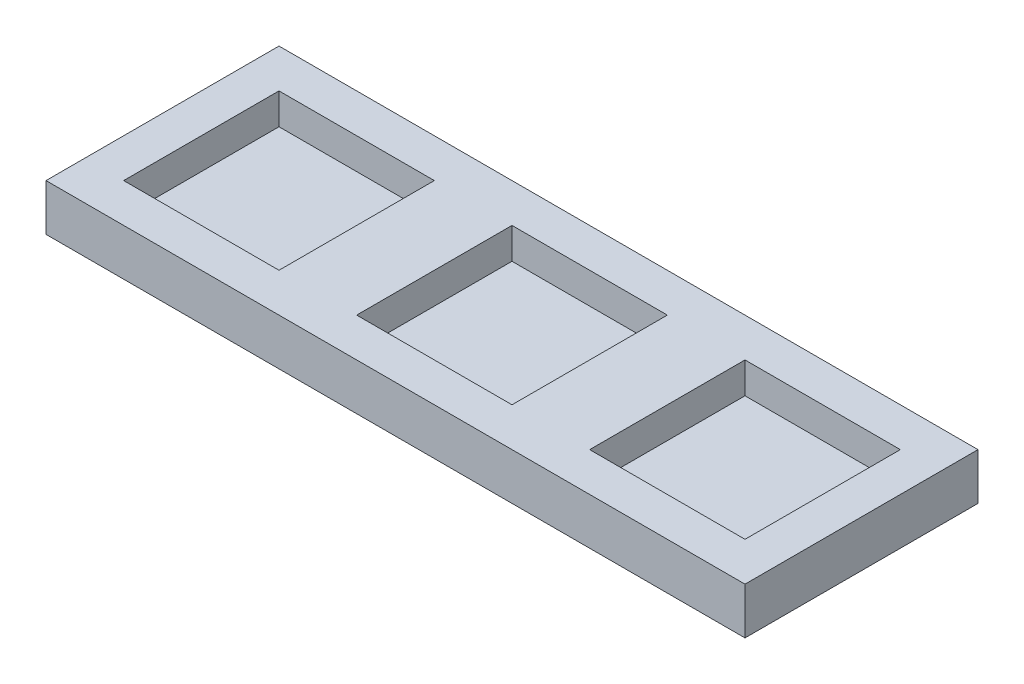
ISO-10303-21;
HEADER;
FILE_DESCRIPTION(('STEP AP214'),'2;1');
FILE_NAME('part.step','',(''),(''),'','','');
FILE_SCHEMA(('AUTOMOTIVE_DESIGN { 1 0 10303 214 1 1 1 1 }'));
ENDSEC;
DATA;
#1=APPLICATION_CONTEXT('core data for automotive mechanical design processes');
#2=APPLICATION_PROTOCOL_DEFINITION('international standard','automotive_design',2000,#1);
#3=PRODUCT_CONTEXT('',#1,'mechanical');
#4=PRODUCT('Part','Part','',(#3));
#5=PRODUCT_RELATED_PRODUCT_CATEGORY('part','',(#4));
#6=PRODUCT_DEFINITION_FORMATION('','',#4);
#7=PRODUCT_DEFINITION_CONTEXT('part definition',#1,'design');
#8=PRODUCT_DEFINITION('design','',#6,#7);
#9=PRODUCT_DEFINITION_SHAPE('','',#8);
#10=(LENGTH_UNIT() NAMED_UNIT(*) SI_UNIT(.MILLI.,.METRE.));
#11=(NAMED_UNIT(*) PLANE_ANGLE_UNIT() SI_UNIT($,.RADIAN.));
#12=(NAMED_UNIT(*) SI_UNIT($,.STERADIAN.) SOLID_ANGLE_UNIT());
#13=UNCERTAINTY_MEASURE_WITH_UNIT(LENGTH_MEASURE(1.E-05),#10,'distance_accuracy_value','');
#14=(GEOMETRIC_REPRESENTATION_CONTEXT(3) GLOBAL_UNCERTAINTY_ASSIGNED_CONTEXT((#13)) GLOBAL_UNIT_ASSIGNED_CONTEXT((#10,
#11,#12)) REPRESENTATION_CONTEXT('',''));
#15=CARTESIAN_POINT('',(0.,0.,0.));
#16=DIRECTION('',(0.,0.,1.));
#17=DIRECTION('',(1.,0.,0.));
#18=AXIS2_PLACEMENT_3D('',#15,#16,#17);
#19=CARTESIAN_POINT('',(-225.,30.,150.));
#20=DIRECTION('',(0.,0.,-1.));
#21=DIRECTION('',(-1.,0.,0.));
#22=AXIS2_PLACEMENT_3D('',#19,#20,#21);
#23=PLANE('',#22);
#24=DIRECTION('',(1.,0.,0.));
#25=VECTOR('',#24,1.);
#26=CARTESIAN_POINT('',(-225.,0.,150.));
#27=LINE('',#26,#25);
#28=CARTESIAN_POINT('',(-225.,0.,150.));
#29=VERTEX_POINT('',#28);
#30=CARTESIAN_POINT('',(225.,0.,150.));
#31=VERTEX_POINT('',#30);
#32=EDGE_CURVE('E184',#29,#31,#27,.T.);
#33=ORIENTED_EDGE('',*,*,#32,.T.);
#34=DIRECTION('',(0.,-1.,0.));
#35=VECTOR('',#34,1.);
#36=CARTESIAN_POINT('',(225.,30.,150.));
#37=LINE('',#36,#35);
#38=CARTESIAN_POINT('',(225.,30.,150.));
#39=VERTEX_POINT('',#38);
#40=EDGE_CURVE('E11',#39,#31,#37,.T.);
#41=ORIENTED_EDGE('',*,*,#40,.F.);
#42=DIRECTION('',(1.,0.,0.));
#43=VECTOR('',#42,1.);
#44=CARTESIAN_POINT('',(-225.,30.,150.));
#45=LINE('',#44,#43);
#46=CARTESIAN_POINT('',(-225.,30.,150.));
#47=VERTEX_POINT('',#46);
#48=EDGE_CURVE('E249',#47,#39,#45,.T.);
#49=ORIENTED_EDGE('',*,*,#48,.F.);
#50=DIRECTION('',(0.,-1.,0.));
#51=VECTOR('',#50,1.);
#52=CARTESIAN_POINT('',(-225.,30.,150.));
#53=LINE('',#52,#51);
#54=EDGE_CURVE('E259',#47,#29,#53,.T.);
#55=ORIENTED_EDGE('',*,*,#54,.T.);
#56=EDGE_LOOP('',(#33,#41,#49,#55));
#57=FACE_BOUND('',#56,.T.);
#58=ADVANCED_FACE('F36',(#57),#23,.F.);
#59=CARTESIAN_POINT('',(225.,30.,150.));
#60=DIRECTION('',(-1.,0.,0.));
#61=DIRECTION('',(0.,0.,1.));
#62=AXIS2_PLACEMENT_3D('',#59,#60,#61);
#63=PLANE('',#62);
#64=DIRECTION('',(0.,0.,-1.));
#65=VECTOR('',#64,1.);
#66=CARTESIAN_POINT('',(225.,0.,150.));
#67=LINE('',#66,#65);
#68=CARTESIAN_POINT('',(225.,0.,0.));
#69=VERTEX_POINT('',#68);
#70=EDGE_CURVE('E262',#31,#69,#67,.T.);
#71=ORIENTED_EDGE('',*,*,#70,.T.);
#72=DIRECTION('',(0.,-1.,0.));
#73=VECTOR('',#72,1.);
#74=CARTESIAN_POINT('',(225.,30.,0.));
#75=LINE('',#74,#73);
#76=CARTESIAN_POINT('',(225.,30.,0.));
#77=VERTEX_POINT('',#76);
#78=EDGE_CURVE('E43',#77,#69,#75,.T.);
#79=ORIENTED_EDGE('',*,*,#78,.F.);
#80=DIRECTION('',(0.,0.,-1.));
#81=VECTOR('',#80,1.);
#82=CARTESIAN_POINT('',(225.,30.,150.));
#83=LINE('',#82,#81);
#84=EDGE_CURVE('E252',#39,#77,#83,.T.);
#85=ORIENTED_EDGE('',*,*,#84,.F.);
#86=ORIENTED_EDGE('',*,*,#40,.T.);
#87=EDGE_LOOP('',(#71,#79,#85,#86));
#88=FACE_BOUND('',#87,.T.);
#89=ADVANCED_FACE('F292',(#88),#63,.F.);
#90=CARTESIAN_POINT('',(225.,30.,0.));
#91=DIRECTION('',(0.,0.,1.));
#92=DIRECTION('',(1.,0.,0.));
#93=AXIS2_PLACEMENT_3D('',#90,#91,#92);
#94=PLANE('',#93);
#95=DIRECTION('',(-1.,0.,0.));
#96=VECTOR('',#95,1.);
#97=CARTESIAN_POINT('',(225.,0.,0.));
#98=LINE('',#97,#96);
#99=CARTESIAN_POINT('',(-225.,0.,0.));
#100=VERTEX_POINT('',#99);
#101=EDGE_CURVE('E264',#69,#100,#98,.T.);
#102=ORIENTED_EDGE('',*,*,#101,.T.);
#103=DIRECTION('',(0.,-1.,0.));
#104=VECTOR('',#103,1.);
#105=CARTESIAN_POINT('',(-225.,30.,0.));
#106=LINE('',#105,#104);
#107=CARTESIAN_POINT('',(-225.,30.,0.));
#108=VERTEX_POINT('',#107);
#109=EDGE_CURVE('E269',#108,#100,#106,.T.);
#110=ORIENTED_EDGE('',*,*,#109,.F.);
#111=DIRECTION('',(-1.,0.,0.));
#112=VECTOR('',#111,1.);
#113=CARTESIAN_POINT('',(225.,30.,0.));
#114=LINE('',#113,#112);
#115=EDGE_CURVE('E255',#77,#108,#114,.T.);
#116=ORIENTED_EDGE('',*,*,#115,.F.);
#117=ORIENTED_EDGE('',*,*,#78,.T.);
#118=EDGE_LOOP('',(#102,#110,#116,#117));
#119=FACE_BOUND('',#118,.T.);
#120=ADVANCED_FACE('F276',(#119),#94,.F.);
#121=CARTESIAN_POINT('',(-225.,30.,0.));
#122=DIRECTION('',(1.,0.,0.));
#123=DIRECTION('',(0.,0.,-1.));
#124=AXIS2_PLACEMENT_3D('',#121,#122,#123);
#125=PLANE('',#124);
#126=DIRECTION('',(0.,0.,1.));
#127=VECTOR('',#126,1.);
#128=CARTESIAN_POINT('',(-225.,0.,0.));
#129=LINE('',#128,#127);
#130=EDGE_CURVE('E253',#100,#29,#129,.T.);
#131=ORIENTED_EDGE('',*,*,#130,.T.);
#132=ORIENTED_EDGE('',*,*,#54,.F.);
#133=DIRECTION('',(0.,0.,1.));
#134=VECTOR('',#133,1.);
#135=CARTESIAN_POINT('',(-225.,30.,0.));
#136=LINE('',#135,#134);
#137=EDGE_CURVE('E257',#108,#47,#136,.T.);
#138=ORIENTED_EDGE('',*,*,#137,.F.);
#139=ORIENTED_EDGE('',*,*,#109,.T.);
#140=EDGE_LOOP('',(#131,#132,#138,#139));
#141=FACE_BOUND('',#140,.T.);
#142=ADVANCED_FACE('F285',(#141),#125,.F.);
#143=CARTESIAN_POINT('',(0.,30.,0.));
#144=DIRECTION('',(0.,1.,0.));
#145=DIRECTION('',(0.,0.,1.));
#146=AXIS2_PLACEMENT_3D('',#143,#144,#145);
#147=PLANE('',#146);
#148=DIRECTION('',(0.,0.,-1.));
#149=VECTOR('',#148,1.);
#150=CARTESIAN_POINT('',(-99.9999999999999,30.,25.0000000000001));
#151=LINE('',#150,#149);
#152=CARTESIAN_POINT('',(-99.9999999999997,30.,125.));
#153=VERTEX_POINT('',#152);
#154=CARTESIAN_POINT('',(-99.9999999999999,30.,25.0000000000001));
#155=VERTEX_POINT('',#154);
#156=EDGE_CURVE('E50',#153,#155,#151,.T.);
#157=ORIENTED_EDGE('',*,*,#156,.F.);
#158=DIRECTION('',(1.,0.,0.));
#159=VECTOR('',#158,1.);
#160=CARTESIAN_POINT('',(-200.,30.,125.));
#161=LINE('',#160,#159);
#162=CARTESIAN_POINT('',(-200.,30.,125.));
#163=VERTEX_POINT('',#162);
#164=EDGE_CURVE('E168',#163,#153,#161,.T.);
#165=ORIENTED_EDGE('',*,*,#164,.F.);
#166=DIRECTION('',(0.,0.,1.));
#167=VECTOR('',#166,1.);
#168=CARTESIAN_POINT('',(-200.,30.,25.0000000000002));
#169=LINE('',#168,#167);
#170=CARTESIAN_POINT('',(-200.,30.,25.0000000000002));
#171=VERTEX_POINT('',#170);
#172=EDGE_CURVE('E171',#171,#163,#169,.T.);
#173=ORIENTED_EDGE('',*,*,#172,.F.);
#174=DIRECTION('',(-1.,0.,0.));
#175=VECTOR('',#174,1.);
#176=CARTESIAN_POINT('',(-200.,30.,25.0000000000002));
#177=LINE('',#176,#175);
#178=EDGE_CURVE('E177',#155,#171,#177,.T.);
#179=ORIENTED_EDGE('',*,*,#178,.F.);
#180=EDGE_LOOP('',(#157,#165,#173,#179));
#181=FACE_BOUND('',#180,.T.);
#182=DIRECTION('',(0.,0.,-1.));
#183=VECTOR('',#182,1.);
#184=CARTESIAN_POINT('',(50.0000000000001,30.,25.0000000000001));
#185=LINE('',#184,#183);
#186=CARTESIAN_POINT('',(50.0000000000003,30.,125.));
#187=VERTEX_POINT('',#186);
#188=CARTESIAN_POINT('',(50.0000000000001,30.,25.0000000000001));
#189=VERTEX_POINT('',#188);
#190=EDGE_CURVE('E58',#187,#189,#185,.T.);
#191=ORIENTED_EDGE('',*,*,#190,.F.);
#192=DIRECTION('',(1.,0.,0.));
#193=VECTOR('',#192,1.);
#194=CARTESIAN_POINT('',(-49.9999999999997,30.,125.));
#195=LINE('',#194,#193);
#196=CARTESIAN_POINT('',(-49.9999999999997,30.,125.));
#197=VERTEX_POINT('',#196);
#198=EDGE_CURVE('E192',#197,#187,#195,.T.);
#199=ORIENTED_EDGE('',*,*,#198,.F.);
#200=DIRECTION('',(0.,0.,1.));
#201=VECTOR('',#200,1.);
#202=CARTESIAN_POINT('',(-49.9999999999999,30.,25.0000000000002));
#203=LINE('',#202,#201);
#204=CARTESIAN_POINT('',(-49.9999999999999,30.,25.0000000000002));
#205=VERTEX_POINT('',#204);
#206=EDGE_CURVE('E207',#205,#197,#203,.T.);
#207=ORIENTED_EDGE('',*,*,#206,.F.);
#208=DIRECTION('',(-1.,0.,0.));
#209=VECTOR('',#208,1.);
#210=CARTESIAN_POINT('',(-49.9999999999999,30.,25.0000000000002));
#211=LINE('',#210,#209);
#212=EDGE_CURVE('E203',#189,#205,#211,.T.);
#213=ORIENTED_EDGE('',*,*,#212,.F.);
#214=EDGE_LOOP('',(#191,#199,#207,#213));
#215=FACE_BOUND('',#214,.T.);
#216=DIRECTION('',(0.,0.,-1.));
#217=VECTOR('',#216,1.);
#218=CARTESIAN_POINT('',(200.,30.,25.0000000000001));
#219=LINE('',#218,#217);
#220=CARTESIAN_POINT('',(200.,30.,125.));
#221=VERTEX_POINT('',#220);
#222=CARTESIAN_POINT('',(200.,30.,25.0000000000001));
#223=VERTEX_POINT('',#222);
#224=EDGE_CURVE('E232',#221,#223,#219,.T.);
#225=ORIENTED_EDGE('',*,*,#224,.F.);
#226=DIRECTION('',(1.,0.,0.));
#227=VECTOR('',#226,1.);
#228=CARTESIAN_POINT('',(100.,30.,125.));
#229=LINE('',#228,#227);
#230=CARTESIAN_POINT('',(100.,30.,125.));
#231=VERTEX_POINT('',#230);
#232=EDGE_CURVE('E222',#231,#221,#229,.T.);
#233=ORIENTED_EDGE('',*,*,#232,.F.);
#234=DIRECTION('',(0.,0.,1.));
#235=VECTOR('',#234,1.);
#236=CARTESIAN_POINT('',(100.,30.,25.0000000000002));
#237=LINE('',#236,#235);
#238=CARTESIAN_POINT('',(100.,30.,25.0000000000002));
#239=VERTEX_POINT('',#238);
#240=EDGE_CURVE('E237',#239,#231,#237,.T.);
#241=ORIENTED_EDGE('',*,*,#240,.F.);
#242=DIRECTION('',(-1.,0.,0.));
#243=VECTOR('',#242,1.);
#244=CARTESIAN_POINT('',(100.,30.,25.0000000000002));
#245=LINE('',#244,#243);
#246=EDGE_CURVE('E234',#223,#239,#245,.T.);
#247=ORIENTED_EDGE('',*,*,#246,.F.);
#248=EDGE_LOOP('',(#225,#233,#241,#247));
#249=FACE_BOUND('',#248,.T.);
#250=ORIENTED_EDGE('',*,*,#48,.T.);
#251=ORIENTED_EDGE('',*,*,#84,.T.);
#252=ORIENTED_EDGE('',*,*,#115,.T.);
#253=ORIENTED_EDGE('',*,*,#137,.T.);
#254=EDGE_LOOP('',(#250,#251,#252,#253));
#255=FACE_BOUND('',#254,.T.);
#256=ADVANCED_FACE('F291',(#181,#215,#249,#255),#147,.T.);
#257=CARTESIAN_POINT('',(0.,0.,0.));
#258=DIRECTION('',(0.,1.,0.));
#259=DIRECTION('',(0.,0.,1.));
#260=AXIS2_PLACEMENT_3D('',#257,#258,#259);
#261=PLANE('',#260);
#262=ORIENTED_EDGE('',*,*,#32,.F.);
#263=ORIENTED_EDGE('',*,*,#130,.F.);
#264=ORIENTED_EDGE('',*,*,#101,.F.);
#265=ORIENTED_EDGE('',*,*,#70,.F.);
#266=EDGE_LOOP('',(#262,#263,#264,#265));
#267=FACE_BOUND('',#266,.T.);
#268=ADVANCED_FACE('F282',(#267),#261,.F.);
#269=CARTESIAN_POINT('',(200.,10.,25.0000000000001));
#270=DIRECTION('',(1.,0.,0.));
#271=DIRECTION('',(0.,0.,-1.));
#272=AXIS2_PLACEMENT_3D('',#269,#270,#271);
#273=PLANE('',#272);
#274=ORIENTED_EDGE('',*,*,#224,.T.);
#275=DIRECTION('',(0.,1.,0.));
#276=VECTOR('',#275,1.);
#277=CARTESIAN_POINT('',(200.,10.,25.0000000000001));
#278=LINE('',#277,#276);
#279=CARTESIAN_POINT('',(200.,10.,25.0000000000001));
#280=VERTEX_POINT('',#279);
#281=EDGE_CURVE('E231',#280,#223,#278,.T.);
#282=ORIENTED_EDGE('',*,*,#281,.F.);
#283=DIRECTION('',(0.,0.,-1.));
#284=VECTOR('',#283,1.);
#285=CARTESIAN_POINT('',(200.,10.,25.0000000000001));
#286=LINE('',#285,#284);
#287=CARTESIAN_POINT('',(200.,10.,125.));
#288=VERTEX_POINT('',#287);
#289=EDGE_CURVE('E218',#288,#280,#286,.T.);
#290=ORIENTED_EDGE('',*,*,#289,.F.);
#291=DIRECTION('',(0.,1.,0.));
#292=VECTOR('',#291,1.);
#293=CARTESIAN_POINT('',(200.,10.,125.));
#294=LINE('',#293,#292);
#295=EDGE_CURVE('E204',#288,#221,#294,.T.);
#296=ORIENTED_EDGE('',*,*,#295,.T.);
#297=EDGE_LOOP('',(#274,#282,#290,#296));
#298=FACE_BOUND('',#297,.T.);
#299=ADVANCED_FACE('F304',(#298),#273,.F.);
#300=CARTESIAN_POINT('',(100.,10.,125.));
#301=DIRECTION('',(0.,0.,1.));
#302=DIRECTION('',(1.,0.,0.));
#303=AXIS2_PLACEMENT_3D('',#300,#301,#302);
#304=PLANE('',#303);
#305=ORIENTED_EDGE('',*,*,#232,.T.);
#306=ORIENTED_EDGE('',*,*,#295,.F.);
#307=DIRECTION('',(1.,0.,0.));
#308=VECTOR('',#307,1.);
#309=CARTESIAN_POINT('',(100.,10.,125.));
#310=LINE('',#309,#308);
#311=CARTESIAN_POINT('',(100.,10.,125.));
#312=VERTEX_POINT('',#311);
#313=EDGE_CURVE('E228',#312,#288,#310,.T.);
#314=ORIENTED_EDGE('',*,*,#313,.F.);
#315=DIRECTION('',(0.,1.,0.));
#316=VECTOR('',#315,1.);
#317=CARTESIAN_POINT('',(100.,10.,125.));
#318=LINE('',#317,#316);
#319=EDGE_CURVE('E243',#312,#231,#318,.T.);
#320=ORIENTED_EDGE('',*,*,#319,.T.);
#321=EDGE_LOOP('',(#305,#306,#314,#320));
#322=FACE_BOUND('',#321,.T.);
#323=ADVANCED_FACE('F310',(#322),#304,.F.);
#324=CARTESIAN_POINT('',(100.,10.,25.0000000000002));
#325=DIRECTION('',(-1.,0.,0.));
#326=DIRECTION('',(0.,0.,1.));
#327=AXIS2_PLACEMENT_3D('',#324,#325,#326);
#328=PLANE('',#327);
#329=ORIENTED_EDGE('',*,*,#240,.T.);
#330=ORIENTED_EDGE('',*,*,#319,.F.);
#331=DIRECTION('',(0.,0.,1.));
#332=VECTOR('',#331,1.);
#333=CARTESIAN_POINT('',(100.,10.,25.0000000000002));
#334=LINE('',#333,#332);
#335=CARTESIAN_POINT('',(100.,10.,25.0000000000002));
#336=VERTEX_POINT('',#335);
#337=EDGE_CURVE('E225',#336,#312,#334,.T.);
#338=ORIENTED_EDGE('',*,*,#337,.F.);
#339=DIRECTION('',(0.,1.,0.));
#340=VECTOR('',#339,1.);
#341=CARTESIAN_POINT('',(100.,10.,25.0000000000002));
#342=LINE('',#341,#340);
#343=EDGE_CURVE('E245',#336,#239,#342,.T.);
#344=ORIENTED_EDGE('',*,*,#343,.T.);
#345=EDGE_LOOP('',(#329,#330,#338,#344));
#346=FACE_BOUND('',#345,.T.);
#347=ADVANCED_FACE('F316',(#346),#328,.F.);
#348=CARTESIAN_POINT('',(100.,10.,25.0000000000002));
#349=DIRECTION('',(0.,0.,-1.));
#350=DIRECTION('',(-1.,0.,0.));
#351=AXIS2_PLACEMENT_3D('',#348,#349,#350);
#352=PLANE('',#351);
#353=ORIENTED_EDGE('',*,*,#246,.T.);
#354=ORIENTED_EDGE('',*,*,#343,.F.);
#355=DIRECTION('',(-1.,0.,0.));
#356=VECTOR('',#355,1.);
#357=CARTESIAN_POINT('',(100.,10.,25.0000000000002));
#358=LINE('',#357,#356);
#359=EDGE_CURVE('E221',#280,#336,#358,.T.);
#360=ORIENTED_EDGE('',*,*,#359,.F.);
#361=ORIENTED_EDGE('',*,*,#281,.T.);
#362=EDGE_LOOP('',(#353,#354,#360,#361));
#363=FACE_BOUND('',#362,.T.);
#364=ADVANCED_FACE('F312',(#363),#352,.F.);
#365=CARTESIAN_POINT('',(0.,10.,0.));
#366=DIRECTION('',(0.,1.,0.));
#367=DIRECTION('',(0.,0.,1.));
#368=AXIS2_PLACEMENT_3D('',#365,#366,#367);
#369=PLANE('',#368);
#370=ORIENTED_EDGE('',*,*,#289,.T.);
#371=ORIENTED_EDGE('',*,*,#359,.T.);
#372=ORIENTED_EDGE('',*,*,#337,.T.);
#373=ORIENTED_EDGE('',*,*,#313,.T.);
#374=EDGE_LOOP('',(#370,#371,#372,#373));
#375=FACE_BOUND('',#374,.T.);
#376=ADVANCED_FACE('F315',(#375),#369,.T.);
#377=CARTESIAN_POINT('',(50.0000000000001,10.,25.0000000000001));
#378=DIRECTION('',(1.,0.,0.));
#379=DIRECTION('',(0.,0.,-1.));
#380=AXIS2_PLACEMENT_3D('',#377,#378,#379);
#381=PLANE('',#380);
#382=ORIENTED_EDGE('',*,*,#190,.T.);
#383=DIRECTION('',(0.,1.,0.));
#384=VECTOR('',#383,1.);
#385=CARTESIAN_POINT('',(50.0000000000001,10.,25.0000000000001));
#386=LINE('',#385,#384);
#387=CARTESIAN_POINT('',(50.0000000000001,10.,25.0000000000001));
#388=VERTEX_POINT('',#387);
#389=EDGE_CURVE('E201',#388,#189,#386,.T.);
#390=ORIENTED_EDGE('',*,*,#389,.F.);
#391=DIRECTION('',(0.,0.,-1.));
#392=VECTOR('',#391,1.);
#393=CARTESIAN_POINT('',(50.0000000000001,10.,25.0000000000001));
#394=LINE('',#393,#392);
#395=CARTESIAN_POINT('',(50.0000000000003,10.,125.));
#396=VERTEX_POINT('',#395);
#397=EDGE_CURVE('E188',#396,#388,#394,.T.);
#398=ORIENTED_EDGE('',*,*,#397,.F.);
#399=DIRECTION('',(0.,1.,0.));
#400=VECTOR('',#399,1.);
#401=CARTESIAN_POINT('',(50.0000000000003,10.,125.));
#402=LINE('',#401,#400);
#403=EDGE_CURVE('E178',#396,#187,#402,.T.);
#404=ORIENTED_EDGE('',*,*,#403,.T.);
#405=EDGE_LOOP('',(#382,#390,#398,#404));
#406=FACE_BOUND('',#405,.T.);
#407=ADVANCED_FACE('F326',(#406),#381,.F.);
#408=CARTESIAN_POINT('',(-49.9999999999997,10.,125.));
#409=DIRECTION('',(0.,0.,1.));
#410=DIRECTION('',(1.,0.,0.));
#411=AXIS2_PLACEMENT_3D('',#408,#409,#410);
#412=PLANE('',#411);
#413=ORIENTED_EDGE('',*,*,#198,.T.);
#414=ORIENTED_EDGE('',*,*,#403,.F.);
#415=DIRECTION('',(1.,0.,0.));
#416=VECTOR('',#415,1.);
#417=CARTESIAN_POINT('',(-49.9999999999997,10.,125.));
#418=LINE('',#417,#416);
#419=CARTESIAN_POINT('',(-49.9999999999997,10.,125.));
#420=VERTEX_POINT('',#419);
#421=EDGE_CURVE('E198',#420,#396,#418,.T.);
#422=ORIENTED_EDGE('',*,*,#421,.F.);
#423=DIRECTION('',(0.,1.,0.));
#424=VECTOR('',#423,1.);
#425=CARTESIAN_POINT('',(-49.9999999999997,10.,125.));
#426=LINE('',#425,#424);
#427=EDGE_CURVE('E213',#420,#197,#426,.T.);
#428=ORIENTED_EDGE('',*,*,#427,.T.);
#429=EDGE_LOOP('',(#413,#414,#422,#428));
#430=FACE_BOUND('',#429,.T.);
#431=ADVANCED_FACE('F330',(#430),#412,.F.);
#432=CARTESIAN_POINT('',(-49.9999999999999,10.,25.0000000000002));
#433=DIRECTION('',(-1.,0.,0.));
#434=DIRECTION('',(0.,0.,1.));
#435=AXIS2_PLACEMENT_3D('',#432,#433,#434);
#436=PLANE('',#435);
#437=ORIENTED_EDGE('',*,*,#206,.T.);
#438=ORIENTED_EDGE('',*,*,#427,.F.);
#439=DIRECTION('',(0.,0.,1.));
#440=VECTOR('',#439,1.);
#441=CARTESIAN_POINT('',(-49.9999999999999,10.,25.0000000000002));
#442=LINE('',#441,#440);
#443=CARTESIAN_POINT('',(-49.9999999999999,10.,25.0000000000002));
#444=VERTEX_POINT('',#443);
#445=EDGE_CURVE('E195',#444,#420,#442,.T.);
#446=ORIENTED_EDGE('',*,*,#445,.F.);
#447=DIRECTION('',(0.,1.,0.));
#448=VECTOR('',#447,1.);
#449=CARTESIAN_POINT('',(-49.9999999999999,10.,25.0000000000002));
#450=LINE('',#449,#448);
#451=EDGE_CURVE('E215',#444,#205,#450,.T.);
#452=ORIENTED_EDGE('',*,*,#451,.T.);
#453=EDGE_LOOP('',(#437,#438,#446,#452));
#454=FACE_BOUND('',#453,.T.);
#455=ADVANCED_FACE('F335',(#454),#436,.F.);
#456=CARTESIAN_POINT('',(-49.9999999999999,10.,25.0000000000002));
#457=DIRECTION('',(0.,0.,-1.));
#458=DIRECTION('',(-1.,0.,0.));
#459=AXIS2_PLACEMENT_3D('',#456,#457,#458);
#460=PLANE('',#459);
#461=ORIENTED_EDGE('',*,*,#212,.T.);
#462=ORIENTED_EDGE('',*,*,#451,.F.);
#463=DIRECTION('',(-1.,0.,0.));
#464=VECTOR('',#463,1.);
#465=CARTESIAN_POINT('',(-49.9999999999999,10.,25.0000000000002));
#466=LINE('',#465,#464);
#467=EDGE_CURVE('E191',#388,#444,#466,.T.);
#468=ORIENTED_EDGE('',*,*,#467,.F.);
#469=ORIENTED_EDGE('',*,*,#389,.T.);
#470=EDGE_LOOP('',(#461,#462,#468,#469));
#471=FACE_BOUND('',#470,.T.);
#472=ADVANCED_FACE('F331',(#471),#460,.F.);
#473=CARTESIAN_POINT('',(0.,10.,0.));
#474=DIRECTION('',(0.,1.,0.));
#475=DIRECTION('',(0.,0.,1.));
#476=AXIS2_PLACEMENT_3D('',#473,#474,#475);
#477=PLANE('',#476);
#478=ORIENTED_EDGE('',*,*,#397,.T.);
#479=ORIENTED_EDGE('',*,*,#467,.T.);
#480=ORIENTED_EDGE('',*,*,#445,.T.);
#481=ORIENTED_EDGE('',*,*,#421,.T.);
#482=EDGE_LOOP('',(#478,#479,#480,#481));
#483=FACE_BOUND('',#482,.T.);
#484=ADVANCED_FACE('F334',(#483),#477,.T.);
#485=CARTESIAN_POINT('',(-99.9999999999999,10.,25.0000000000001));
#486=DIRECTION('',(1.,0.,0.));
#487=DIRECTION('',(0.,0.,-1.));
#488=AXIS2_PLACEMENT_3D('',#485,#486,#487);
#489=PLANE('',#488);
#490=ORIENTED_EDGE('',*,*,#156,.T.);
#491=DIRECTION('',(0.,1.,0.));
#492=VECTOR('',#491,1.);
#493=CARTESIAN_POINT('',(-99.9999999999999,10.,25.0000000000001));
#494=LINE('',#493,#492);
#495=CARTESIAN_POINT('',(-99.9999999999999,10.,25.0000000000001));
#496=VERTEX_POINT('',#495);
#497=EDGE_CURVE('E146',#496,#155,#494,.T.);
#498=ORIENTED_EDGE('',*,*,#497,.F.);
#499=DIRECTION('',(0.,0.,-1.));
#500=VECTOR('',#499,1.);
#501=CARTESIAN_POINT('',(-99.9999999999999,10.,25.0000000000001));
#502=LINE('',#501,#500);
#503=CARTESIAN_POINT('',(-99.9999999999997,10.,125.));
#504=VERTEX_POINT('',#503);
#505=EDGE_CURVE('E150',#504,#496,#502,.T.);
#506=ORIENTED_EDGE('',*,*,#505,.F.);
#507=DIRECTION('',(0.,1.,0.));
#508=VECTOR('',#507,1.);
#509=CARTESIAN_POINT('',(-99.9999999999997,10.,125.));
#510=LINE('',#509,#508);
#511=EDGE_CURVE('E182',#504,#153,#510,.T.);
#512=ORIENTED_EDGE('',*,*,#511,.T.);
#513=EDGE_LOOP('',(#490,#498,#506,#512));
#514=FACE_BOUND('',#513,.T.);
#515=ADVANCED_FACE('F148',(#514),#489,.F.);
#516=CARTESIAN_POINT('',(-200.,10.,125.));
#517=DIRECTION('',(0.,0.,1.));
#518=DIRECTION('',(1.,0.,0.));
#519=AXIS2_PLACEMENT_3D('',#516,#517,#518);
#520=PLANE('',#519);
#521=ORIENTED_EDGE('',*,*,#164,.T.);
#522=ORIENTED_EDGE('',*,*,#511,.F.);
#523=DIRECTION('',(1.,0.,0.));
#524=VECTOR('',#523,1.);
#525=CARTESIAN_POINT('',(-200.,10.,125.));
#526=LINE('',#525,#524);
#527=CARTESIAN_POINT('',(-200.,10.,125.));
#528=VERTEX_POINT('',#527);
#529=EDGE_CURVE('E156',#528,#504,#526,.T.);
#530=ORIENTED_EDGE('',*,*,#529,.F.);
#531=DIRECTION('',(0.,1.,0.));
#532=VECTOR('',#531,1.);
#533=CARTESIAN_POINT('',(-200.,10.,125.));
#534=LINE('',#533,#532);
#535=EDGE_CURVE('E185',#528,#163,#534,.T.);
#536=ORIENTED_EDGE('',*,*,#535,.T.);
#537=EDGE_LOOP('',(#521,#522,#530,#536));
#538=FACE_BOUND('',#537,.T.);
#539=ADVANCED_FACE('F348',(#538),#520,.F.);
#540=CARTESIAN_POINT('',(-200.,10.,25.0000000000002));
#541=DIRECTION('',(-1.,0.,0.));
#542=DIRECTION('',(0.,0.,1.));
#543=AXIS2_PLACEMENT_3D('',#540,#541,#542);
#544=PLANE('',#543);
#545=ORIENTED_EDGE('',*,*,#172,.T.);
#546=ORIENTED_EDGE('',*,*,#535,.F.);
#547=DIRECTION('',(0.,0.,1.));
#548=VECTOR('',#547,1.);
#549=CARTESIAN_POINT('',(-200.,10.,25.0000000000002));
#550=LINE('',#549,#548);
#551=CARTESIAN_POINT('',(-200.,10.,25.0000000000002));
#552=VERTEX_POINT('',#551);
#553=EDGE_CURVE('E164',#552,#528,#550,.T.);
#554=ORIENTED_EDGE('',*,*,#553,.F.);
#555=DIRECTION('',(0.,1.,0.));
#556=VECTOR('',#555,1.);
#557=CARTESIAN_POINT('',(-200.,10.,25.0000000000002));
#558=LINE('',#557,#556);
#559=EDGE_CURVE('E155',#552,#171,#558,.T.);
#560=ORIENTED_EDGE('',*,*,#559,.T.);
#561=EDGE_LOOP('',(#545,#546,#554,#560));
#562=FACE_BOUND('',#561,.T.);
#563=ADVANCED_FACE('F351',(#562),#544,.F.);
#564=CARTESIAN_POINT('',(-200.,10.,25.0000000000002));
#565=DIRECTION('',(0.,0.,-1.));
#566=DIRECTION('',(-1.,0.,0.));
#567=AXIS2_PLACEMENT_3D('',#564,#565,#566);
#568=PLANE('',#567);
#569=ORIENTED_EDGE('',*,*,#178,.T.);
#570=ORIENTED_EDGE('',*,*,#559,.F.);
#571=DIRECTION('',(-1.,0.,0.));
#572=VECTOR('',#571,1.);
#573=CARTESIAN_POINT('',(-200.,10.,25.0000000000002));
#574=LINE('',#573,#572);
#575=EDGE_CURVE('E159',#496,#552,#574,.T.);
#576=ORIENTED_EDGE('',*,*,#575,.F.);
#577=ORIENTED_EDGE('',*,*,#497,.T.);
#578=EDGE_LOOP('',(#569,#570,#576,#577));
#579=FACE_BOUND('',#578,.T.);
#580=ADVANCED_FACE('F160',(#579),#568,.F.);
#581=CARTESIAN_POINT('',(0.,10.,0.));
#582=DIRECTION('',(0.,1.,0.));
#583=DIRECTION('',(0.,0.,1.));
#584=AXIS2_PLACEMENT_3D('',#581,#582,#583);
#585=PLANE('',#584);
#586=ORIENTED_EDGE('',*,*,#505,.T.);
#587=ORIENTED_EDGE('',*,*,#575,.T.);
#588=ORIENTED_EDGE('',*,*,#553,.T.);
#589=ORIENTED_EDGE('',*,*,#529,.T.);
#590=EDGE_LOOP('',(#586,#587,#588,#589));
#591=FACE_BOUND('',#590,.T.);
#592=ADVANCED_FACE('F166',(#591),#585,.T.);
#593=CLOSED_SHELL('',(#58,#89,#120,#142,#256,#268,#299,#323,#347,#364,#376,#407,#431,#455,#472,
#484,#515,#539,#563,#580,#592));
#594=MANIFOLD_SOLID_BREP('B2',#593);
#595=ADVANCED_BREP_SHAPE_REPRESENTATION('',(#18,#594),#14);
#596=SHAPE_DEFINITION_REPRESENTATION(#9,#595);
ENDSEC;
END-ISO-10303-21;
